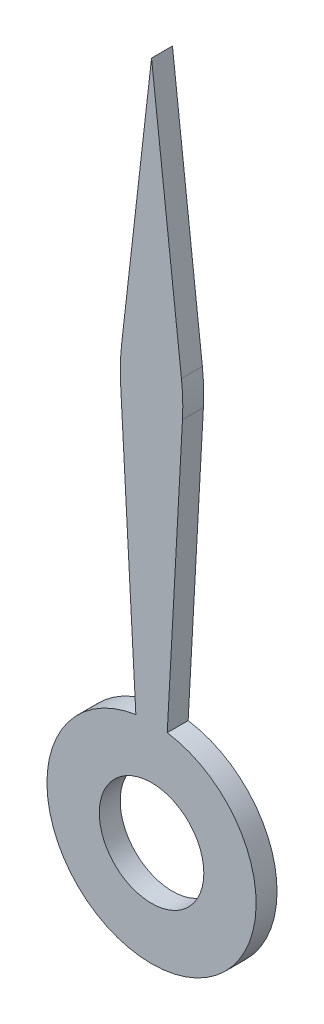
ISO-10303-21;
HEADER;
FILE_DESCRIPTION(('STEP AP214'),'2;1');
FILE_NAME('part.step','',(''),(''),'','','');
FILE_SCHEMA(('AUTOMOTIVE_DESIGN { 1 0 10303 214 1 1 1 1 }'));
ENDSEC;
DATA;
#1=APPLICATION_CONTEXT('core data for automotive mechanical design processes');
#2=APPLICATION_PROTOCOL_DEFINITION('international standard','automotive_design',2000,#1);
#3=PRODUCT_CONTEXT('',#1,'mechanical');
#4=PRODUCT('Part','Part','',(#3));
#5=PRODUCT_RELATED_PRODUCT_CATEGORY('part','',(#4));
#6=PRODUCT_DEFINITION_FORMATION('','',#4);
#7=PRODUCT_DEFINITION_CONTEXT('part definition',#1,'design');
#8=PRODUCT_DEFINITION('design','',#6,#7);
#9=PRODUCT_DEFINITION_SHAPE('','',#8);
#10=(LENGTH_UNIT() NAMED_UNIT(*) SI_UNIT(.MILLI.,.METRE.));
#11=(NAMED_UNIT(*) PLANE_ANGLE_UNIT() SI_UNIT($,.RADIAN.));
#12=(NAMED_UNIT(*) SI_UNIT($,.STERADIAN.) SOLID_ANGLE_UNIT());
#13=UNCERTAINTY_MEASURE_WITH_UNIT(LENGTH_MEASURE(1.E-05),#10,'distance_accuracy_value','');
#14=(GEOMETRIC_REPRESENTATION_CONTEXT(3) GLOBAL_UNCERTAINTY_ASSIGNED_CONTEXT((#13)) GLOBAL_UNIT_ASSIGNED_CONTEXT((#10,
#11,#12)) REPRESENTATION_CONTEXT('',''));
#15=CARTESIAN_POINT('',(0.,0.,0.));
#16=DIRECTION('',(0.,0.,1.));
#17=DIRECTION('',(1.,0.,0.));
#18=AXIS2_PLACEMENT_3D('',#15,#16,#17);
#19=CARTESIAN_POINT('',(1.70113575213335,3.7630972639969,0.2));
#20=DIRECTION('',(0.,0.,1.));
#21=DIRECTION('',(1.,0.,0.));
#22=AXIS2_PLACEMENT_3D('',#19,#20,#21);
#23=PLANE('',#22);
#24=CARTESIAN_POINT('',(1.70113575213335,3.7630972639969,0.2));
#25=DIRECTION('',(0.,0.,1.));
#26=DIRECTION('',(1.,0.,0.));
#27=AXIS2_PLACEMENT_3D('',#24,#25,#26);
#28=CIRCLE('',#27,2.);
#29=CARTESIAN_POINT('',(-0.286010359731469,3.98948262151926,0.2));
#30=VERTEX_POINT('',#29);
#31=CARTESIAN_POINT('',(-0.295875020989374,3.65379048455587,0.2));
#32=VERTEX_POINT('',#31);
#33=EDGE_CURVE('E136',#30,#32,#28,.T.);
#34=ORIENTED_EDGE('',*,*,#33,.T.);
#35=DIRECTION('',(0.0546533897205183,-0.998505386561363,0.));
#36=VECTOR('',#35,1.);
#37=CARTESIAN_POINT('',(-0.295875020989374,3.65379048455587,0.2));
#38=LINE('',#37,#36);
#39=CARTESIAN_POINT('',(-0.15,0.988685996664259,0.2));
#40=VERTEX_POINT('',#39);
#41=EDGE_CURVE('E89',#32,#40,#38,.T.);
#42=ORIENTED_EDGE('',*,*,#41,.T.);
#43=CARTESIAN_POINT('',(0.,0.,0.2));
#44=DIRECTION('',(0.,0.,1.));
#45=DIRECTION('',(1.,0.,0.));
#46=AXIS2_PLACEMENT_3D('',#43,#44,#45);
#47=CIRCLE('',#46,1.);
#48=CARTESIAN_POINT('',(0.15,0.988685996664259,0.2));
#49=VERTEX_POINT('',#48);
#50=EDGE_CURVE('E148',#40,#49,#47,.T.);
#51=ORIENTED_EDGE('',*,*,#50,.T.);
#52=DIRECTION('',(0.0546533897205183,0.998505386561363,0.));
#53=VECTOR('',#52,1.);
#54=CARTESIAN_POINT('',(0.295875020989374,3.65379048455587,0.2));
#55=LINE('',#54,#53);
#56=CARTESIAN_POINT('',(0.295875020989374,3.65379048455587,0.2));
#57=VERTEX_POINT('',#56);
#58=EDGE_CURVE('E105',#49,#57,#55,.T.);
#59=ORIENTED_EDGE('',*,*,#58,.T.);
#60=CARTESIAN_POINT('',(-1.70113575213335,3.7630972639969,0.2));
#61=DIRECTION('',(0.,0.,1.));
#62=DIRECTION('',(-1.,0.,0.));
#63=AXIS2_PLACEMENT_3D('',#60,#61,#62);
#64=CIRCLE('',#63,2.);
#65=CARTESIAN_POINT('',(0.286010359731469,3.98948262151926,0.2));
#66=VERTEX_POINT('',#65);
#67=EDGE_CURVE('E99',#57,#66,#64,.T.);
#68=ORIENTED_EDGE('',*,*,#67,.T.);
#69=DIRECTION('',(-0.113192678761177,0.993573055932411,0.));
#70=VECTOR('',#69,1.);
#71=CARTESIAN_POINT('',(0.,6.5,0.2));
#72=LINE('',#71,#70);
#73=CARTESIAN_POINT('',(0.,6.5,0.2));
#74=VERTEX_POINT('',#73);
#75=EDGE_CURVE('E103',#66,#74,#72,.T.);
#76=ORIENTED_EDGE('',*,*,#75,.T.);
#77=DIRECTION('',(-0.113192678761177,-0.993573055932411,0.));
#78=VECTOR('',#77,1.);
#79=CARTESIAN_POINT('',(0.,6.5,0.2));
#80=LINE('',#79,#78);
#81=EDGE_CURVE('E49',#74,#30,#80,.T.);
#82=ORIENTED_EDGE('',*,*,#81,.T.);
#83=EDGE_LOOP('',(#34,#42,#51,#59,#68,#76,#82));
#84=FACE_BOUND('',#83,.T.);
#85=CARTESIAN_POINT('',(0.,0.,0.2));
#86=DIRECTION('',(0.,0.,1.));
#87=DIRECTION('',(1.,0.,0.));
#88=AXIS2_PLACEMENT_3D('',#85,#86,#87);
#89=CIRCLE('',#88,0.5);
#90=CARTESIAN_POINT('',(0.5,0.,0.2));
#91=VERTEX_POINT('',#90);
#92=EDGE_CURVE('E127',#91,#91,#89,.T.);
#93=ORIENTED_EDGE('',*,*,#92,.F.);
#94=EDGE_LOOP('',(#93));
#95=FACE_BOUND('',#94,.T.);
#96=ADVANCED_FACE('F32',(#84,#95),#23,.T.);
#97=CARTESIAN_POINT('',(1.70113575213335,3.7630972639969,0.));
#98=DIRECTION('',(0.,0.,1.));
#99=DIRECTION('',(1.,0.,0.));
#100=AXIS2_PLACEMENT_3D('',#97,#98,#99);
#101=PLANE('',#100);
#102=CARTESIAN_POINT('',(1.70113575213335,3.7630972639969,0.));
#103=DIRECTION('',(0.,0.,1.));
#104=DIRECTION('',(1.,0.,0.));
#105=AXIS2_PLACEMENT_3D('',#102,#103,#104);
#106=CIRCLE('',#105,2.);
#107=CARTESIAN_POINT('',(-0.286010359731469,3.98948262151926,0.));
#108=VERTEX_POINT('',#107);
#109=CARTESIAN_POINT('',(-0.295875020989374,3.65379048455587,0.));
#110=VERTEX_POINT('',#109);
#111=EDGE_CURVE('E123',#108,#110,#106,.T.);
#112=ORIENTED_EDGE('',*,*,#111,.F.);
#113=DIRECTION('',(-0.113192678761177,-0.993573055932411,0.));
#114=VECTOR('',#113,1.);
#115=CARTESIAN_POINT('',(0.,6.5,0.));
#116=LINE('',#115,#114);
#117=CARTESIAN_POINT('',(0.,6.5,0.));
#118=VERTEX_POINT('',#117);
#119=EDGE_CURVE('E81',#118,#108,#116,.T.);
#120=ORIENTED_EDGE('',*,*,#119,.F.);
#121=DIRECTION('',(-0.113192678761177,0.993573055932411,0.));
#122=VECTOR('',#121,1.);
#123=CARTESIAN_POINT('',(0.,6.5,0.));
#124=LINE('',#123,#122);
#125=CARTESIAN_POINT('',(0.286010359731469,3.98948262151926,0.));
#126=VERTEX_POINT('',#125);
#127=EDGE_CURVE('E75',#126,#118,#124,.T.);
#128=ORIENTED_EDGE('',*,*,#127,.F.);
#129=CARTESIAN_POINT('',(-1.70113575213335,3.7630972639969,0.));
#130=DIRECTION('',(0.,0.,1.));
#131=DIRECTION('',(-1.,0.,0.));
#132=AXIS2_PLACEMENT_3D('',#129,#130,#131);
#133=CIRCLE('',#132,2.);
#134=CARTESIAN_POINT('',(0.295875020989374,3.65379048455587,0.));
#135=VERTEX_POINT('',#134);
#136=EDGE_CURVE('E113',#135,#126,#133,.T.);
#137=ORIENTED_EDGE('',*,*,#136,.F.);
#138=DIRECTION('',(0.0546533897205183,0.998505386561363,0.));
#139=VECTOR('',#138,1.);
#140=CARTESIAN_POINT('',(0.295875020989374,3.65379048455587,0.));
#141=LINE('',#140,#139);
#142=CARTESIAN_POINT('',(0.15,0.988685996664259,0.));
#143=VERTEX_POINT('',#142);
#144=EDGE_CURVE('E131',#143,#135,#141,.T.);
#145=ORIENTED_EDGE('',*,*,#144,.F.);
#146=CARTESIAN_POINT('',(0.,0.,0.));
#147=DIRECTION('',(0.,0.,1.));
#148=DIRECTION('',(1.,0.,0.));
#149=AXIS2_PLACEMENT_3D('',#146,#147,#148);
#150=CIRCLE('',#149,1.);
#151=CARTESIAN_POINT('',(-0.15,0.988685996664259,0.));
#152=VERTEX_POINT('',#151);
#153=EDGE_CURVE('E129',#152,#143,#150,.T.);
#154=ORIENTED_EDGE('',*,*,#153,.F.);
#155=DIRECTION('',(0.0546533897205183,-0.998505386561363,0.));
#156=VECTOR('',#155,1.);
#157=CARTESIAN_POINT('',(-0.295875020989374,3.65379048455587,0.));
#158=LINE('',#157,#156);
#159=EDGE_CURVE('E126',#110,#152,#158,.T.);
#160=ORIENTED_EDGE('',*,*,#159,.F.);
#161=EDGE_LOOP('',(#112,#120,#128,#137,#145,#154,#160));
#162=FACE_BOUND('',#161,.T.);
#163=CARTESIAN_POINT('',(0.,0.,0.));
#164=DIRECTION('',(0.,0.,1.));
#165=DIRECTION('',(1.,0.,0.));
#166=AXIS2_PLACEMENT_3D('',#163,#164,#165);
#167=CIRCLE('',#166,0.5);
#168=CARTESIAN_POINT('',(0.5,0.,0.));
#169=VERTEX_POINT('',#168);
#170=EDGE_CURVE('E160',#169,#169,#167,.T.);
#171=ORIENTED_EDGE('',*,*,#170,.T.);
#172=EDGE_LOOP('',(#171));
#173=FACE_BOUND('',#172,.T.);
#174=ADVANCED_FACE('F152',(#162,#173),#101,.F.);
#175=CARTESIAN_POINT('',(1.70113575213335,3.7630972639969,0.2));
#176=DIRECTION('',(0.,0.,-1.));
#177=DIRECTION('',(-1.,0.,0.));
#178=AXIS2_PLACEMENT_3D('',#175,#176,#177);
#179=CYLINDRICAL_SURFACE('',#178,2.);
#180=ORIENTED_EDGE('',*,*,#111,.T.);
#181=DIRECTION('',(0.,0.,-1.));
#182=VECTOR('',#181,1.);
#183=CARTESIAN_POINT('',(-0.295875020989374,3.65379048455587,0.2));
#184=LINE('',#183,#182);
#185=EDGE_CURVE('E11',#32,#110,#184,.T.);
#186=ORIENTED_EDGE('',*,*,#185,.F.);
#187=ORIENTED_EDGE('',*,*,#33,.F.);
#188=DIRECTION('',(0.,0.,-1.));
#189=VECTOR('',#188,1.);
#190=CARTESIAN_POINT('',(-0.286010359731469,3.98948262151926,0.2));
#191=LINE('',#190,#189);
#192=EDGE_CURVE('E119',#30,#108,#191,.T.);
#193=ORIENTED_EDGE('',*,*,#192,.T.);
#194=EDGE_LOOP('',(#180,#186,#187,#193));
#195=FACE_BOUND('',#194,.T.);
#196=ADVANCED_FACE('F34',(#195),#179,.T.);
#197=CARTESIAN_POINT('',(-0.295875020989374,3.65379048455587,0.2));
#198=DIRECTION('',(0.998505386561363,0.0546533897205183,0.));
#199=DIRECTION('',(-0.0546533897205183,0.998505386561363,0.));
#200=AXIS2_PLACEMENT_3D('',#197,#198,#199);
#201=PLANE('',#200);
#202=ORIENTED_EDGE('',*,*,#159,.T.);
#203=DIRECTION('',(0.,0.,-1.));
#204=VECTOR('',#203,1.);
#205=CARTESIAN_POINT('',(-0.15,0.988685996664259,0.2));
#206=LINE('',#205,#204);
#207=EDGE_CURVE('E41',#40,#152,#206,.T.);
#208=ORIENTED_EDGE('',*,*,#207,.F.);
#209=ORIENTED_EDGE('',*,*,#41,.F.);
#210=ORIENTED_EDGE('',*,*,#185,.T.);
#211=EDGE_LOOP('',(#202,#208,#209,#210));
#212=FACE_BOUND('',#211,.T.);
#213=ADVANCED_FACE('F186',(#212),#201,.F.);
#214=CARTESIAN_POINT('',(0.,0.,0.2));
#215=DIRECTION('',(0.,0.,-1.));
#216=DIRECTION('',(-1.,0.,0.));
#217=AXIS2_PLACEMENT_3D('',#214,#215,#216);
#218=CYLINDRICAL_SURFACE('',#217,1.);
#219=ORIENTED_EDGE('',*,*,#153,.T.);
#220=DIRECTION('',(0.,0.,-1.));
#221=VECTOR('',#220,1.);
#222=CARTESIAN_POINT('',(0.15,0.988685996664259,0.2));
#223=LINE('',#222,#221);
#224=EDGE_CURVE('E140',#49,#143,#223,.T.);
#225=ORIENTED_EDGE('',*,*,#224,.F.);
#226=ORIENTED_EDGE('',*,*,#50,.F.);
#227=ORIENTED_EDGE('',*,*,#207,.T.);
#228=EDGE_LOOP('',(#219,#225,#226,#227));
#229=FACE_BOUND('',#228,.T.);
#230=ADVANCED_FACE('F146',(#229),#218,.T.);
#231=CARTESIAN_POINT('',(0.295875020989374,3.65379048455587,0.2));
#232=DIRECTION('',(-0.998505386561363,0.0546533897205183,0.));
#233=DIRECTION('',(-0.0546533897205183,-0.998505386561363,0.));
#234=AXIS2_PLACEMENT_3D('',#231,#232,#233);
#235=PLANE('',#234);
#236=ORIENTED_EDGE('',*,*,#144,.T.);
#237=DIRECTION('',(0.,0.,-1.));
#238=VECTOR('',#237,1.);
#239=CARTESIAN_POINT('',(0.295875020989374,3.65379048455587,0.2));
#240=LINE('',#239,#238);
#241=EDGE_CURVE('E114',#57,#135,#240,.T.);
#242=ORIENTED_EDGE('',*,*,#241,.F.);
#243=ORIENTED_EDGE('',*,*,#58,.F.);
#244=ORIENTED_EDGE('',*,*,#224,.T.);
#245=EDGE_LOOP('',(#236,#242,#243,#244));
#246=FACE_BOUND('',#245,.T.);
#247=ADVANCED_FACE('F155',(#246),#235,.F.);
#248=CARTESIAN_POINT('',(-1.70113575213335,3.7630972639969,0.2));
#249=DIRECTION('',(0.,0.,-1.));
#250=DIRECTION('',(-1.,0.,0.));
#251=AXIS2_PLACEMENT_3D('',#248,#249,#250);
#252=CYLINDRICAL_SURFACE('',#251,2.);
#253=ORIENTED_EDGE('',*,*,#136,.T.);
#254=DIRECTION('',(0.,0.,-1.));
#255=VECTOR('',#254,1.);
#256=CARTESIAN_POINT('',(0.286010359731469,3.98948262151926,0.2));
#257=LINE('',#256,#255);
#258=EDGE_CURVE('E110',#66,#126,#257,.T.);
#259=ORIENTED_EDGE('',*,*,#258,.F.);
#260=ORIENTED_EDGE('',*,*,#67,.F.);
#261=ORIENTED_EDGE('',*,*,#241,.T.);
#262=EDGE_LOOP('',(#253,#259,#260,#261));
#263=FACE_BOUND('',#262,.T.);
#264=ADVANCED_FACE('F111',(#263),#252,.T.);
#265=CARTESIAN_POINT('',(0.,6.5,0.2));
#266=DIRECTION('',(-0.993573055932411,-0.113192678761177,0.));
#267=DIRECTION('',(0.113192678761177,-0.993573055932411,0.));
#268=AXIS2_PLACEMENT_3D('',#265,#266,#267);
#269=PLANE('',#268);
#270=ORIENTED_EDGE('',*,*,#127,.T.);
#271=DIRECTION('',(0.,0.,-1.));
#272=VECTOR('',#271,1.);
#273=CARTESIAN_POINT('',(0.,6.5,0.2));
#274=LINE('',#273,#272);
#275=EDGE_CURVE('E115',#74,#118,#274,.T.);
#276=ORIENTED_EDGE('',*,*,#275,.F.);
#277=ORIENTED_EDGE('',*,*,#75,.F.);
#278=ORIENTED_EDGE('',*,*,#258,.T.);
#279=EDGE_LOOP('',(#270,#276,#277,#278));
#280=FACE_BOUND('',#279,.T.);
#281=ADVANCED_FACE('F117',(#280),#269,.F.);
#282=CARTESIAN_POINT('',(0.,6.5,0.2));
#283=DIRECTION('',(0.993573055932411,-0.113192678761177,0.));
#284=DIRECTION('',(0.113192678761177,0.993573055932411,0.));
#285=AXIS2_PLACEMENT_3D('',#282,#283,#284);
#286=PLANE('',#285);
#287=ORIENTED_EDGE('',*,*,#119,.T.);
#288=ORIENTED_EDGE('',*,*,#192,.F.);
#289=ORIENTED_EDGE('',*,*,#81,.F.);
#290=ORIENTED_EDGE('',*,*,#275,.T.);
#291=EDGE_LOOP('',(#287,#288,#289,#290));
#292=FACE_BOUND('',#291,.T.);
#293=ADVANCED_FACE('F176',(#292),#286,.F.);
#294=CARTESIAN_POINT('',(0.,0.,0.2));
#295=DIRECTION('',(0.,0.,-1.));
#296=DIRECTION('',(-1.,0.,0.));
#297=AXIS2_PLACEMENT_3D('',#294,#295,#296);
#298=CYLINDRICAL_SURFACE('',#297,0.5);
#299=ORIENTED_EDGE('',*,*,#92,.T.);
#300=EDGE_LOOP('',(#299));
#301=FACE_BOUND('',#300,.T.);
#302=ORIENTED_EDGE('',*,*,#170,.F.);
#303=EDGE_LOOP('',(#302));
#304=FACE_BOUND('',#303,.T.);
#305=ADVANCED_FACE('F166',(#301,#304),#298,.F.);
#306=CLOSED_SHELL('',(#96,#174,#196,#213,#230,#247,#264,#281,#293,#305));
#307=MANIFOLD_SOLID_BREP('B2',#306);
#308=ADVANCED_BREP_SHAPE_REPRESENTATION('',(#18,#307),#14);
#309=SHAPE_DEFINITION_REPRESENTATION(#9,#308);
ENDSEC;
END-ISO-10303-21;
